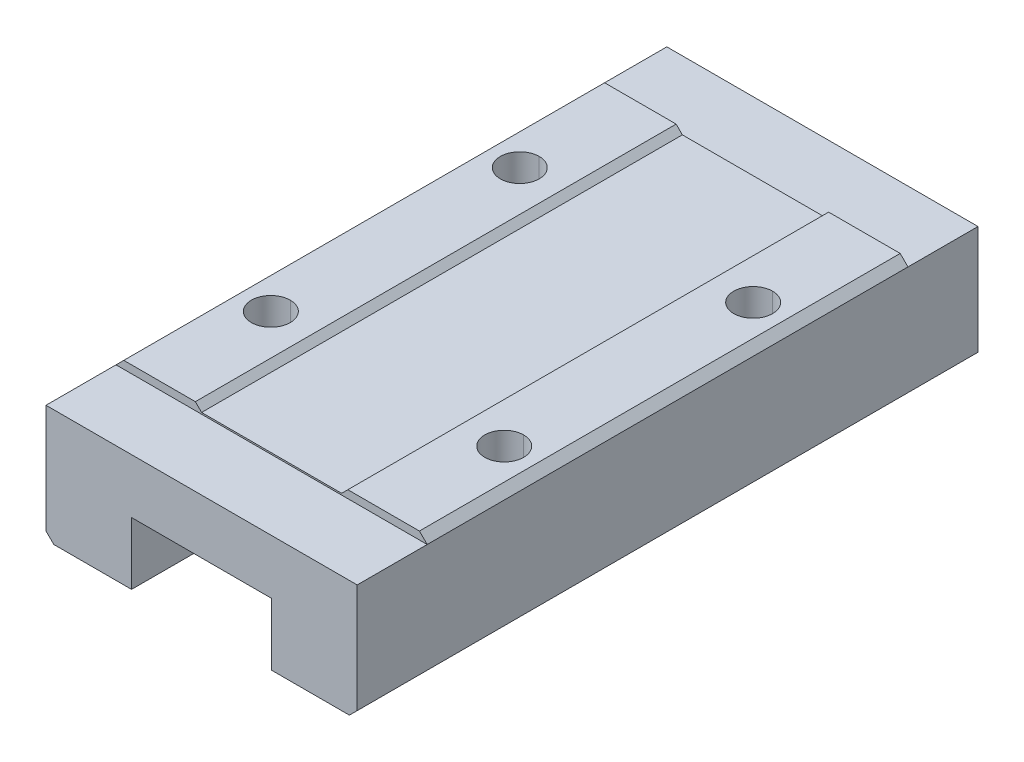
ISO-10303-21;
HEADER;
FILE_DESCRIPTION(('STEP AP214'),'2;1');
FILE_NAME('part.step','',(''),(''),'','','');
FILE_SCHEMA(('AUTOMOTIVE_DESIGN { 1 0 10303 214 1 1 1 1 }'));
ENDSEC;
DATA;
#1=APPLICATION_CONTEXT('core data for automotive mechanical design processes');
#2=APPLICATION_PROTOCOL_DEFINITION('international standard','automotive_design',2000,#1);
#3=PRODUCT_CONTEXT('',#1,'mechanical');
#4=PRODUCT('Part','Part','',(#3));
#5=PRODUCT_RELATED_PRODUCT_CATEGORY('part','',(#4));
#6=PRODUCT_DEFINITION_FORMATION('','',#4);
#7=PRODUCT_DEFINITION_CONTEXT('part definition',#1,'design');
#8=PRODUCT_DEFINITION('design','',#6,#7);
#9=PRODUCT_DEFINITION_SHAPE('','',#8);
#10=(LENGTH_UNIT() NAMED_UNIT(*) SI_UNIT(.MILLI.,.METRE.));
#11=(NAMED_UNIT(*) PLANE_ANGLE_UNIT() SI_UNIT($,.RADIAN.));
#12=(NAMED_UNIT(*) SI_UNIT($,.STERADIAN.) SOLID_ANGLE_UNIT());
#13=UNCERTAINTY_MEASURE_WITH_UNIT(LENGTH_MEASURE(1.E-05),#10,'distance_accuracy_value','');
#14=(GEOMETRIC_REPRESENTATION_CONTEXT(3) GLOBAL_UNCERTAINTY_ASSIGNED_CONTEXT((#13)) GLOBAL_UNIT_ASSIGNED_CONTEXT((#10,
#11,#12)) REPRESENTATION_CONTEXT('',''));
#15=CARTESIAN_POINT('',(0.,0.,0.));
#16=DIRECTION('',(0.,0.,1.));
#17=DIRECTION('',(1.,0.,0.));
#18=AXIS2_PLACEMENT_3D('',#15,#16,#17);
#19=CARTESIAN_POINT('',(-4.5,9.6,-19.95));
#20=DIRECTION('',(-0.707106781186548,-0.707106781186548,0.));
#21=DIRECTION('',(-0.707106781186548,0.707106781186548,0.));
#22=AXIS2_PLACEMENT_3D('',#19,#20,#21);
#23=PLANE('',#22);
#24=DIRECTION('',(0.707106781186548,-0.707106781186548,0.));
#25=VECTOR('',#24,1.);
#26=CARTESIAN_POINT('',(-4.5,9.6,-15.45));
#27=LINE('',#26,#25);
#28=CARTESIAN_POINT('',(-4.9,10.,-15.45));
#29=VERTEX_POINT('',#28);
#30=CARTESIAN_POINT('',(-4.5,9.6,-15.45));
#31=VERTEX_POINT('',#30);
#32=EDGE_CURVE('E371',#29,#31,#27,.T.);
#33=ORIENTED_EDGE('',*,*,#32,.F.);
#34=DIRECTION('',(0.,0.,-1.));
#35=VECTOR('',#34,1.);
#36=CARTESIAN_POINT('',(-4.9,10.,19.95));
#37=LINE('',#36,#35);
#38=CARTESIAN_POINT('',(-4.9,10.,15.45));
#39=VERTEX_POINT('',#38);
#40=EDGE_CURVE('E316',#39,#29,#37,.T.);
#41=ORIENTED_EDGE('',*,*,#40,.F.);
#42=DIRECTION('',(-0.707106781186548,0.707106781186548,0.));
#43=VECTOR('',#42,1.);
#44=CARTESIAN_POINT('',(-4.5,9.6,15.45));
#45=LINE('',#44,#43);
#46=CARTESIAN_POINT('',(-4.5,9.6,15.45));
#47=VERTEX_POINT('',#46);
#48=EDGE_CURVE('E299',#47,#39,#45,.T.);
#49=ORIENTED_EDGE('',*,*,#48,.F.);
#50=DIRECTION('',(0.,0.,1.));
#51=VECTOR('',#50,1.);
#52=CARTESIAN_POINT('',(-4.5,9.6,-19.95));
#53=LINE('',#52,#51);
#54=EDGE_CURVE('E28',#31,#47,#53,.T.);
#55=ORIENTED_EDGE('',*,*,#54,.F.);
#56=EDGE_LOOP('',(#33,#41,#49,#55));
#57=FACE_BOUND('',#56,.T.);
#58=ADVANCED_FACE('F17',(#57),#23,.F.);
#59=CARTESIAN_POINT('',(4.9,10.,19.95));
#60=DIRECTION('',(0.707106781186548,-0.707106781186547,0.));
#61=DIRECTION('',(0.,0.,-1.));
#62=AXIS2_PLACEMENT_3D('',#59,#60,#61);
#63=PLANE('',#62);
#64=DIRECTION('',(0.707106781186547,0.707106781186548,0.));
#65=VECTOR('',#64,1.);
#66=CARTESIAN_POINT('',(4.9,10.,-15.45));
#67=LINE('',#66,#65);
#68=CARTESIAN_POINT('',(4.5,9.6,-15.45));
#69=VERTEX_POINT('',#68);
#70=CARTESIAN_POINT('',(4.9,10.,-15.45));
#71=VERTEX_POINT('',#70);
#72=EDGE_CURVE('E222',#69,#71,#67,.T.);
#73=ORIENTED_EDGE('',*,*,#72,.F.);
#74=DIRECTION('',(0.,0.,1.));
#75=VECTOR('',#74,1.);
#76=CARTESIAN_POINT('',(4.5,9.6,-19.95));
#77=LINE('',#76,#75);
#78=CARTESIAN_POINT('',(4.5,9.6,15.45));
#79=VERTEX_POINT('',#78);
#80=EDGE_CURVE('E11',#69,#79,#77,.T.);
#81=ORIENTED_EDGE('',*,*,#80,.T.);
#82=DIRECTION('',(-0.707106781186547,-0.707106781186548,0.));
#83=VECTOR('',#82,1.);
#84=CARTESIAN_POINT('',(4.9,10.,15.45));
#85=LINE('',#84,#83);
#86=CARTESIAN_POINT('',(4.9,10.,15.45));
#87=VERTEX_POINT('',#86);
#88=EDGE_CURVE('E367',#87,#79,#85,.T.);
#89=ORIENTED_EDGE('',*,*,#88,.F.);
#90=DIRECTION('',(0.,0.,1.));
#91=VECTOR('',#90,1.);
#92=CARTESIAN_POINT('',(4.9,10.,19.95));
#93=LINE('',#92,#91);
#94=EDGE_CURVE('E21',#71,#87,#93,.T.);
#95=ORIENTED_EDGE('',*,*,#94,.F.);
#96=EDGE_LOOP('',(#73,#81,#89,#95));
#97=FACE_BOUND('',#96,.T.);
#98=ADVANCED_FACE('F680',(#97),#63,.F.);
#99=CARTESIAN_POINT('',(-4.5,9.6,-19.95));
#100=DIRECTION('',(0.,-1.,0.));
#101=DIRECTION('',(0.,0.,-1.));
#102=AXIS2_PLACEMENT_3D('',#99,#100,#101);
#103=PLANE('',#102);
#104=ORIENTED_EDGE('',*,*,#54,.T.);
#105=DIRECTION('',(-1.,0.,0.));
#106=VECTOR('',#105,1.);
#107=CARTESIAN_POINT('',(10.,9.6,15.45));
#108=LINE('',#107,#106);
#109=EDGE_CURVE('E303',#79,#47,#108,.T.);
#110=ORIENTED_EDGE('',*,*,#109,.F.);
#111=ORIENTED_EDGE('',*,*,#80,.F.);
#112=DIRECTION('',(1.,0.,0.));
#113=VECTOR('',#112,1.);
#114=CARTESIAN_POINT('',(-10.,9.6,-15.45));
#115=LINE('',#114,#113);
#116=EDGE_CURVE('E298',#31,#69,#115,.T.);
#117=ORIENTED_EDGE('',*,*,#116,.F.);
#118=EDGE_LOOP('',(#104,#110,#111,#117));
#119=FACE_BOUND('',#118,.T.);
#120=ADVANCED_FACE('F686',(#119),#103,.F.);
#121=CARTESIAN_POINT('',(0.,9.5,0.));
#122=DIRECTION('',(0.,1.,0.));
#123=DIRECTION('',(1.,0.,0.));
#124=AXIS2_PLACEMENT_3D('',#121,#122,#123);
#125=PLANE('',#124);
#126=DIRECTION('',(0.,0.,-1.));
#127=VECTOR('',#126,1.);
#128=CARTESIAN_POINT('',(10.,9.5,19.95));
#129=LINE('',#128,#127);
#130=CARTESIAN_POINT('',(10.,9.5,19.95));
#131=VERTEX_POINT('',#130);
#132=CARTESIAN_POINT('',(10.,9.5,15.45));
#133=VERTEX_POINT('',#132);
#134=EDGE_CURVE('E225',#131,#133,#129,.T.);
#135=ORIENTED_EDGE('',*,*,#134,.T.);
#136=DIRECTION('',(-1.,0.,0.));
#137=VECTOR('',#136,1.);
#138=CARTESIAN_POINT('',(10.,9.5,15.45));
#139=LINE('',#138,#137);
#140=CARTESIAN_POINT('',(-10.,9.5,15.45));
#141=VERTEX_POINT('',#140);
#142=EDGE_CURVE('E302',#133,#141,#139,.T.);
#143=ORIENTED_EDGE('',*,*,#142,.T.);
#144=DIRECTION('',(0.,0.,-1.));
#145=VECTOR('',#144,1.);
#146=CARTESIAN_POINT('',(-10.,9.5,19.95));
#147=LINE('',#146,#145);
#148=CARTESIAN_POINT('',(-10.,9.5,19.95));
#149=VERTEX_POINT('',#148);
#150=EDGE_CURVE('E270',#149,#141,#147,.T.);
#151=ORIENTED_EDGE('',*,*,#150,.F.);
#152=DIRECTION('',(1.,0.,0.));
#153=VECTOR('',#152,1.);
#154=CARTESIAN_POINT('',(10.,9.5,19.95));
#155=LINE('',#154,#153);
#156=EDGE_CURVE('E339',#149,#131,#155,.T.);
#157=ORIENTED_EDGE('',*,*,#156,.T.);
#158=EDGE_LOOP('',(#135,#143,#151,#157));
#159=FACE_BOUND('',#158,.T.);
#160=ADVANCED_FACE('F579',(#159),#125,.T.);
#161=CARTESIAN_POINT('',(10.,9.5,15.45));
#162=DIRECTION('',(0.,0.,-1.));
#163=DIRECTION('',(-1.,0.,0.));
#164=AXIS2_PLACEMENT_3D('',#161,#162,#163);
#165=PLANE('',#164);
#166=DIRECTION('',(-1.,0.,0.));
#167=VECTOR('',#166,1.);
#168=CARTESIAN_POINT('',(10.,10.,15.45));
#169=LINE('',#168,#167);
#170=CARTESIAN_POINT('',(9.5,10.,15.45));
#171=VERTEX_POINT('',#170);
#172=EDGE_CURVE('E215',#171,#87,#169,.T.);
#173=ORIENTED_EDGE('',*,*,#172,.T.);
#174=ORIENTED_EDGE('',*,*,#88,.T.);
#175=ORIENTED_EDGE('',*,*,#109,.T.);
#176=ORIENTED_EDGE('',*,*,#48,.T.);
#177=DIRECTION('',(-1.,0.,0.));
#178=VECTOR('',#177,1.);
#179=CARTESIAN_POINT('',(10.,10.,15.45));
#180=LINE('',#179,#178);
#181=CARTESIAN_POINT('',(-9.5,10.,15.45));
#182=VERTEX_POINT('',#181);
#183=EDGE_CURVE('E321',#39,#182,#180,.T.);
#184=ORIENTED_EDGE('',*,*,#183,.T.);
#185=DIRECTION('',(-0.707106781186548,-0.707106781186548,0.));
#186=VECTOR('',#185,1.);
#187=CARTESIAN_POINT('',(-10.,9.5,15.45));
#188=LINE('',#187,#186);
#189=EDGE_CURVE('E206',#182,#141,#188,.T.);
#190=ORIENTED_EDGE('',*,*,#189,.T.);
#191=ORIENTED_EDGE('',*,*,#142,.F.);
#192=DIRECTION('',(-0.707106781186548,0.707106781186548,0.));
#193=VECTOR('',#192,1.);
#194=CARTESIAN_POINT('',(9.5,10.,15.45));
#195=LINE('',#194,#193);
#196=EDGE_CURVE('E207',#133,#171,#195,.T.);
#197=ORIENTED_EDGE('',*,*,#196,.T.);
#198=EDGE_LOOP('',(#173,#174,#175,#176,#184,#190,#191,#197));
#199=FACE_BOUND('',#198,.T.);
#200=ADVANCED_FACE('F514',(#199),#165,.F.);
#201=CARTESIAN_POINT('',(0.,9.5,0.));
#202=DIRECTION('',(0.,1.,0.));
#203=DIRECTION('',(1.,0.,0.));
#204=AXIS2_PLACEMENT_3D('',#201,#202,#203);
#205=PLANE('',#204);
#206=DIRECTION('',(0.,0.,1.));
#207=VECTOR('',#206,1.);
#208=CARTESIAN_POINT('',(-10.,9.5,-19.95));
#209=LINE('',#208,#207);
#210=CARTESIAN_POINT('',(-10.,9.5,-19.95));
#211=VERTEX_POINT('',#210);
#212=CARTESIAN_POINT('',(-10.,9.5,-15.45));
#213=VERTEX_POINT('',#212);
#214=EDGE_CURVE('E353',#211,#213,#209,.T.);
#215=ORIENTED_EDGE('',*,*,#214,.T.);
#216=DIRECTION('',(1.,0.,0.));
#217=VECTOR('',#216,1.);
#218=CARTESIAN_POINT('',(-10.,9.5,-15.45));
#219=LINE('',#218,#217);
#220=CARTESIAN_POINT('',(10.,9.5,-15.45));
#221=VERTEX_POINT('',#220);
#222=EDGE_CURVE('E297',#213,#221,#219,.T.);
#223=ORIENTED_EDGE('',*,*,#222,.T.);
#224=DIRECTION('',(0.,0.,1.));
#225=VECTOR('',#224,1.);
#226=CARTESIAN_POINT('',(10.,9.5,19.95));
#227=LINE('',#226,#225);
#228=CARTESIAN_POINT('',(10.,9.5,-19.95));
#229=VERTEX_POINT('',#228);
#230=EDGE_CURVE('E413',#229,#221,#227,.T.);
#231=ORIENTED_EDGE('',*,*,#230,.F.);
#232=DIRECTION('',(-1.,0.,0.));
#233=VECTOR('',#232,1.);
#234=CARTESIAN_POINT('',(-10.,9.5,-19.95));
#235=LINE('',#234,#233);
#236=EDGE_CURVE('E259',#229,#211,#235,.T.);
#237=ORIENTED_EDGE('',*,*,#236,.T.);
#238=EDGE_LOOP('',(#215,#223,#231,#237));
#239=FACE_BOUND('',#238,.T.);
#240=ADVANCED_FACE('F568',(#239),#205,.T.);
#241=CARTESIAN_POINT('',(-10.,9.5,-15.45));
#242=DIRECTION('',(0.,0.,1.));
#243=DIRECTION('',(1.,0.,0.));
#244=AXIS2_PLACEMENT_3D('',#241,#242,#243);
#245=PLANE('',#244);
#246=ORIENTED_EDGE('',*,*,#116,.T.);
#247=ORIENTED_EDGE('',*,*,#72,.T.);
#248=DIRECTION('',(1.,0.,0.));
#249=VECTOR('',#248,1.);
#250=CARTESIAN_POINT('',(-10.,10.,-15.45));
#251=LINE('',#250,#249);
#252=CARTESIAN_POINT('',(9.5,10.,-15.45));
#253=VERTEX_POINT('',#252);
#254=EDGE_CURVE('E213',#71,#253,#251,.T.);
#255=ORIENTED_EDGE('',*,*,#254,.T.);
#256=DIRECTION('',(0.707106781186548,-0.707106781186548,0.));
#257=VECTOR('',#256,1.);
#258=CARTESIAN_POINT('',(9.5,10.,-15.45));
#259=LINE('',#258,#257);
#260=EDGE_CURVE('E194',#253,#221,#259,.T.);
#261=ORIENTED_EDGE('',*,*,#260,.T.);
#262=ORIENTED_EDGE('',*,*,#222,.F.);
#263=DIRECTION('',(0.707106781186548,0.707106781186548,0.));
#264=VECTOR('',#263,1.);
#265=CARTESIAN_POINT('',(-10.,9.5,-15.45));
#266=LINE('',#265,#264);
#267=CARTESIAN_POINT('',(-9.5,10.,-15.45));
#268=VERTEX_POINT('',#267);
#269=EDGE_CURVE('E274',#213,#268,#266,.T.);
#270=ORIENTED_EDGE('',*,*,#269,.T.);
#271=DIRECTION('',(1.,0.,0.));
#272=VECTOR('',#271,1.);
#273=CARTESIAN_POINT('',(-10.,10.,-15.45));
#274=LINE('',#273,#272);
#275=EDGE_CURVE('E320',#268,#29,#274,.T.);
#276=ORIENTED_EDGE('',*,*,#275,.T.);
#277=ORIENTED_EDGE('',*,*,#32,.T.);
#278=EDGE_LOOP('',(#246,#247,#255,#261,#262,#270,#276,#277));
#279=FACE_BOUND('',#278,.T.);
#280=ADVANCED_FACE('F220',(#279),#245,.F.);
#281=CARTESIAN_POINT('',(-10.,9.5,19.95));
#282=DIRECTION('',(0.707106781186548,-0.707106781186548,0.));
#283=DIRECTION('',(0.,0.,-1.));
#284=AXIS2_PLACEMENT_3D('',#281,#282,#283);
#285=PLANE('',#284);
#286=ORIENTED_EDGE('',*,*,#189,.F.);
#287=DIRECTION('',(0.,0.,1.));
#288=VECTOR('',#287,1.);
#289=CARTESIAN_POINT('',(-9.5,10.,19.95));
#290=LINE('',#289,#288);
#291=EDGE_CURVE('E429',#268,#182,#290,.T.);
#292=ORIENTED_EDGE('',*,*,#291,.F.);
#293=ORIENTED_EDGE('',*,*,#269,.F.);
#294=DIRECTION('',(0.,0.,-1.));
#295=VECTOR('',#294,1.);
#296=CARTESIAN_POINT('',(-10.,9.5,19.95));
#297=LINE('',#296,#295);
#298=EDGE_CURVE('E349',#141,#213,#297,.T.);
#299=ORIENTED_EDGE('',*,*,#298,.F.);
#300=EDGE_LOOP('',(#286,#292,#293,#299));
#301=FACE_BOUND('',#300,.T.);
#302=ADVANCED_FACE('F571',(#301),#285,.F.);
#303=CARTESIAN_POINT('',(9.5,10.,19.95));
#304=DIRECTION('',(-0.707106781186548,-0.707106781186548,0.));
#305=DIRECTION('',(-0.707106781186548,0.707106781186548,0.));
#306=AXIS2_PLACEMENT_3D('',#303,#304,#305);
#307=PLANE('',#306);
#308=ORIENTED_EDGE('',*,*,#196,.F.);
#309=DIRECTION('',(0.,0.,1.));
#310=VECTOR('',#309,1.);
#311=CARTESIAN_POINT('',(10.,9.5,19.95));
#312=LINE('',#311,#310);
#313=EDGE_CURVE('E201',#221,#133,#312,.T.);
#314=ORIENTED_EDGE('',*,*,#313,.F.);
#315=ORIENTED_EDGE('',*,*,#260,.F.);
#316=DIRECTION('',(0.,0.,-1.));
#317=VECTOR('',#316,1.);
#318=CARTESIAN_POINT('',(9.5,10.,19.95));
#319=LINE('',#318,#317);
#320=EDGE_CURVE('E198',#171,#253,#319,.T.);
#321=ORIENTED_EDGE('',*,*,#320,.F.);
#322=EDGE_LOOP('',(#308,#314,#315,#321));
#323=FACE_BOUND('',#322,.T.);
#324=ADVANCED_FACE('F197',(#323),#307,.F.);
#325=CARTESIAN_POINT('',(10.,2.5,19.95));
#326=DIRECTION('',(-0.707106781186548,0.707106781186548,0.));
#327=DIRECTION('',(0.,0.,1.));
#328=AXIS2_PLACEMENT_3D('',#325,#326,#327);
#329=PLANE('',#328);
#330=DIRECTION('',(0.707106781186548,0.707106781186548,0.));
#331=VECTOR('',#330,1.);
#332=CARTESIAN_POINT('',(10.,2.5,19.95));
#333=LINE('',#332,#331);
#334=CARTESIAN_POINT('',(9.5,2.,19.95));
#335=VERTEX_POINT('',#334);
#336=CARTESIAN_POINT('',(10.,2.5,19.95));
#337=VERTEX_POINT('',#336);
#338=EDGE_CURVE('E237',#335,#337,#333,.T.);
#339=ORIENTED_EDGE('',*,*,#338,.F.);
#340=DIRECTION('',(0.,0.,1.));
#341=VECTOR('',#340,1.);
#342=CARTESIAN_POINT('',(9.5,2.,19.95));
#343=LINE('',#342,#341);
#344=CARTESIAN_POINT('',(9.5,2.,-19.95));
#345=VERTEX_POINT('',#344);
#346=EDGE_CURVE('E382',#345,#335,#343,.T.);
#347=ORIENTED_EDGE('',*,*,#346,.F.);
#348=DIRECTION('',(-0.707106781186548,-0.707106781186548,0.));
#349=VECTOR('',#348,1.);
#350=CARTESIAN_POINT('',(3.75,-3.75,-19.95));
#351=LINE('',#350,#349);
#352=CARTESIAN_POINT('',(10.,2.5,-19.95));
#353=VERTEX_POINT('',#352);
#354=EDGE_CURVE('E258',#353,#345,#351,.T.);
#355=ORIENTED_EDGE('',*,*,#354,.F.);
#356=DIRECTION('',(0.,0.,-1.));
#357=VECTOR('',#356,1.);
#358=CARTESIAN_POINT('',(10.,2.5,19.95));
#359=LINE('',#358,#357);
#360=EDGE_CURVE('E446',#337,#353,#359,.T.);
#361=ORIENTED_EDGE('',*,*,#360,.F.);
#362=EDGE_LOOP('',(#339,#347,#355,#361));
#363=FACE_BOUND('',#362,.T.);
#364=ADVANCED_FACE('F630',(#363),#329,.F.);
#365=CARTESIAN_POINT('',(-9.5,2.,19.95));
#366=DIRECTION('',(0.707106781186548,0.707106781186548,0.));
#367=DIRECTION('',(0.,0.,-1.));
#368=AXIS2_PLACEMENT_3D('',#365,#366,#367);
#369=PLANE('',#368);
#370=DIRECTION('',(0.707106781186548,-0.707106781186548,0.));
#371=VECTOR('',#370,1.);
#372=CARTESIAN_POINT('',(-9.5,2.,19.95));
#373=LINE('',#372,#371);
#374=CARTESIAN_POINT('',(-10.,2.5,19.95));
#375=VERTEX_POINT('',#374);
#376=CARTESIAN_POINT('',(-9.5,2.,19.95));
#377=VERTEX_POINT('',#376);
#378=EDGE_CURVE('E433',#375,#377,#373,.T.);
#379=ORIENTED_EDGE('',*,*,#378,.F.);
#380=DIRECTION('',(0.,0.,1.));
#381=VECTOR('',#380,1.);
#382=CARTESIAN_POINT('',(-10.,2.5,19.95));
#383=LINE('',#382,#381);
#384=CARTESIAN_POINT('',(-10.,2.5,-19.95));
#385=VERTEX_POINT('',#384);
#386=EDGE_CURVE('E266',#385,#375,#383,.T.);
#387=ORIENTED_EDGE('',*,*,#386,.F.);
#388=DIRECTION('',(-0.707106781186548,0.707106781186548,0.));
#389=VECTOR('',#388,1.);
#390=CARTESIAN_POINT('',(-3.75,-3.75,-19.95));
#391=LINE('',#390,#389);
#392=CARTESIAN_POINT('',(-9.5,2.,-19.95));
#393=VERTEX_POINT('',#392);
#394=EDGE_CURVE('E348',#393,#385,#391,.T.);
#395=ORIENTED_EDGE('',*,*,#394,.F.);
#396=DIRECTION('',(0.,0.,-1.));
#397=VECTOR('',#396,1.);
#398=CARTESIAN_POINT('',(-9.5,2.,19.95));
#399=LINE('',#398,#397);
#400=EDGE_CURVE('E394',#377,#393,#399,.T.);
#401=ORIENTED_EDGE('',*,*,#400,.F.);
#402=EDGE_LOOP('',(#379,#387,#395,#401));
#403=FACE_BOUND('',#402,.T.);
#404=ADVANCED_FACE('F725',(#403),#369,.F.);
#405=CARTESIAN_POINT('',(-7.5,10.,-8.));
#406=DIRECTION('',(0.,1.,0.));
#407=DIRECTION('',(0.,0.,1.));
#408=AXIS2_PLACEMENT_3D('',#405,#406,#407);
#409=CYLINDRICAL_SURFACE('',#408,1.25);
#410=DIRECTION('',(0.,1.,0.));
#411=VECTOR('',#410,1.);
#412=CARTESIAN_POINT('',(-7.5,10.,-9.25));
#413=LINE('',#412,#411);
#414=CARTESIAN_POINT('',(-7.5,5.6,-9.25));
#415=VERTEX_POINT('',#414);
#416=CARTESIAN_POINT('',(-7.5,10.,-9.25));
#417=VERTEX_POINT('',#416);
#418=EDGE_CURVE('E304',#415,#417,#413,.T.);
#419=ORIENTED_EDGE('',*,*,#418,.F.);
#420=CARTESIAN_POINT('',(-7.5,5.6,-8.));
#421=DIRECTION('',(0.,1.,0.));
#422=DIRECTION('',(0.,0.,1.));
#423=AXIS2_PLACEMENT_3D('',#420,#421,#422);
#424=CIRCLE('',#423,1.25);
#425=CARTESIAN_POINT('',(-7.5,5.6,-6.75));
#426=VERTEX_POINT('',#425);
#427=EDGE_CURVE('E246',#426,#415,#424,.T.);
#428=ORIENTED_EDGE('',*,*,#427,.F.);
#429=DIRECTION('',(0.,1.,0.));
#430=VECTOR('',#429,1.);
#431=CARTESIAN_POINT('',(-7.5,10.,-6.75));
#432=LINE('',#431,#430);
#433=CARTESIAN_POINT('',(-7.5,10.,-6.75));
#434=VERTEX_POINT('',#433);
#435=EDGE_CURVE('E410',#426,#434,#432,.T.);
#436=ORIENTED_EDGE('',*,*,#435,.T.);
#437=CARTESIAN_POINT('',(-7.5,10.,-8.));
#438=DIRECTION('',(0.,1.,0.));
#439=DIRECTION('',(0.,0.,1.));
#440=AXIS2_PLACEMENT_3D('',#437,#438,#439);
#441=CIRCLE('',#440,1.25);
#442=EDGE_CURVE('E344',#434,#417,#441,.T.);
#443=ORIENTED_EDGE('',*,*,#442,.T.);
#444=EDGE_LOOP('',(#419,#428,#436,#443));
#445=FACE_BOUND('',#444,.T.);
#446=ADVANCED_FACE('F723',(#445),#409,.F.);
#447=CARTESIAN_POINT('',(-7.5,5.6,-8.));
#448=DIRECTION('',(0.,1.,0.));
#449=DIRECTION('',(0.,0.,1.));
#450=AXIS2_PLACEMENT_3D('',#447,#448,#449);
#451=CONICAL_SURFACE('',#450,1.25,1.02974425867665);
#452=DIRECTION('',(0.,0.515038074910055,-0.857167300702112));
#453=VECTOR('',#452,1.);
#454=CARTESIAN_POINT('',(-7.5,5.6,-9.25));
#455=LINE('',#454,#453);
#456=CARTESIAN_POINT('',(-7.5,4.84892422621555,-8.));
#457=VERTEX_POINT('',#456);
#458=EDGE_CURVE('E395',#457,#415,#455,.T.);
#459=ORIENTED_EDGE('',*,*,#458,.F.);
#460=DIRECTION('',(0.,0.515038074910055,0.857167300702112));
#461=VECTOR('',#460,1.);
#462=CARTESIAN_POINT('',(-7.5,5.6,-6.75));
#463=LINE('',#462,#461);
#464=EDGE_CURVE('E400',#457,#426,#463,.T.);
#465=ORIENTED_EDGE('',*,*,#464,.T.);
#466=ORIENTED_EDGE('',*,*,#427,.T.);
#467=EDGE_LOOP('',(#459,#465,#466));
#468=FACE_BOUND('',#467,.T.);
#469=ADVANCED_FACE('F675',(#468),#451,.F.);
#470=CARTESIAN_POINT('',(7.5,10.,8.));
#471=DIRECTION('',(0.,1.,0.));
#472=DIRECTION('',(0.,0.,1.));
#473=AXIS2_PLACEMENT_3D('',#470,#471,#472);
#474=CYLINDRICAL_SURFACE('',#473,1.25);
#475=DIRECTION('',(0.,1.,0.));
#476=VECTOR('',#475,1.);
#477=CARTESIAN_POINT('',(7.5,10.,6.75));
#478=LINE('',#477,#476);
#479=CARTESIAN_POINT('',(7.5,5.6,6.75));
#480=VERTEX_POINT('',#479);
#481=CARTESIAN_POINT('',(7.5,10.,6.75));
#482=VERTEX_POINT('',#481);
#483=EDGE_CURVE('E315',#480,#482,#478,.T.);
#484=ORIENTED_EDGE('',*,*,#483,.F.);
#485=CARTESIAN_POINT('',(7.5,5.6,8.));
#486=DIRECTION('',(0.,1.,0.));
#487=DIRECTION('',(0.,0.,1.));
#488=AXIS2_PLACEMENT_3D('',#485,#486,#487);
#489=CIRCLE('',#488,1.25);
#490=CARTESIAN_POINT('',(7.5,5.6,9.25));
#491=VERTEX_POINT('',#490);
#492=EDGE_CURVE('E361',#491,#480,#489,.T.);
#493=ORIENTED_EDGE('',*,*,#492,.F.);
#494=DIRECTION('',(0.,1.,0.));
#495=VECTOR('',#494,1.);
#496=CARTESIAN_POINT('',(7.5,10.,9.25));
#497=LINE('',#496,#495);
#498=CARTESIAN_POINT('',(7.5,10.,9.25));
#499=VERTEX_POINT('',#498);
#500=EDGE_CURVE('E314',#491,#499,#497,.T.);
#501=ORIENTED_EDGE('',*,*,#500,.T.);
#502=CARTESIAN_POINT('',(7.5,10.,8.));
#503=DIRECTION('',(0.,1.,0.));
#504=DIRECTION('',(0.,0.,1.));
#505=AXIS2_PLACEMENT_3D('',#502,#503,#504);
#506=CIRCLE('',#505,1.25);
#507=EDGE_CURVE('E217',#499,#482,#506,.T.);
#508=ORIENTED_EDGE('',*,*,#507,.T.);
#509=EDGE_LOOP('',(#484,#493,#501,#508));
#510=FACE_BOUND('',#509,.T.);
#511=ADVANCED_FACE('F655',(#510),#474,.F.);
#512=CARTESIAN_POINT('',(7.5,5.6,8.));
#513=DIRECTION('',(0.,1.,0.));
#514=DIRECTION('',(0.,0.,1.));
#515=AXIS2_PLACEMENT_3D('',#512,#513,#514);
#516=CONICAL_SURFACE('',#515,1.25,1.02974425867665);
#517=DIRECTION('',(0.,0.515038074910055,-0.857167300702112));
#518=VECTOR('',#517,1.);
#519=CARTESIAN_POINT('',(7.5,5.6,6.75));
#520=LINE('',#519,#518);
#521=CARTESIAN_POINT('',(7.5,4.84892422621555,8.));
#522=VERTEX_POINT('',#521);
#523=EDGE_CURVE('E288',#522,#480,#520,.T.);
#524=ORIENTED_EDGE('',*,*,#523,.F.);
#525=DIRECTION('',(0.,0.515038074910055,0.857167300702112));
#526=VECTOR('',#525,1.);
#527=CARTESIAN_POINT('',(7.5,5.6,9.25));
#528=LINE('',#527,#526);
#529=EDGE_CURVE('E330',#522,#491,#528,.T.);
#530=ORIENTED_EDGE('',*,*,#529,.T.);
#531=ORIENTED_EDGE('',*,*,#492,.T.);
#532=EDGE_LOOP('',(#524,#530,#531));
#533=FACE_BOUND('',#532,.T.);
#534=ADVANCED_FACE('F663',(#533),#516,.F.);
#535=CARTESIAN_POINT('',(7.5,10.,-8.));
#536=DIRECTION('',(0.,1.,0.));
#537=DIRECTION('',(0.,0.,1.));
#538=AXIS2_PLACEMENT_3D('',#535,#536,#537);
#539=CYLINDRICAL_SURFACE('',#538,1.25);
#540=DIRECTION('',(0.,1.,0.));
#541=VECTOR('',#540,1.);
#542=CARTESIAN_POINT('',(7.5,10.,-9.25));
#543=LINE('',#542,#541);
#544=CARTESIAN_POINT('',(7.5,5.6,-9.25));
#545=VERTEX_POINT('',#544);
#546=CARTESIAN_POINT('',(7.5,10.,-9.25));
#547=VERTEX_POINT('',#546);
#548=EDGE_CURVE('E287',#545,#547,#543,.T.);
#549=ORIENTED_EDGE('',*,*,#548,.F.);
#550=CARTESIAN_POINT('',(7.5,5.6,-8.));
#551=DIRECTION('',(0.,1.,0.));
#552=DIRECTION('',(0.,0.,1.));
#553=AXIS2_PLACEMENT_3D('',#550,#551,#552);
#554=CIRCLE('',#553,1.25);
#555=CARTESIAN_POINT('',(7.5,5.6,-6.75));
#556=VERTEX_POINT('',#555);
#557=EDGE_CURVE('E417',#556,#545,#554,.T.);
#558=ORIENTED_EDGE('',*,*,#557,.F.);
#559=DIRECTION('',(0.,1.,0.));
#560=VECTOR('',#559,1.);
#561=CARTESIAN_POINT('',(7.5,10.,-6.75));
#562=LINE('',#561,#560);
#563=CARTESIAN_POINT('',(7.5,10.,-6.75));
#564=VERTEX_POINT('',#563);
#565=EDGE_CURVE('E338',#556,#564,#562,.T.);
#566=ORIENTED_EDGE('',*,*,#565,.T.);
#567=CARTESIAN_POINT('',(7.5,10.,-8.));
#568=DIRECTION('',(0.,1.,0.));
#569=DIRECTION('',(0.,0.,1.));
#570=AXIS2_PLACEMENT_3D('',#567,#568,#569);
#571=CIRCLE('',#570,1.25);
#572=EDGE_CURVE('E249',#564,#547,#571,.T.);
#573=ORIENTED_EDGE('',*,*,#572,.T.);
#574=EDGE_LOOP('',(#549,#558,#566,#573));
#575=FACE_BOUND('',#574,.T.);
#576=ADVANCED_FACE('F665',(#575),#539,.F.);
#577=CARTESIAN_POINT('',(7.5,5.6,-8.));
#578=DIRECTION('',(0.,1.,0.));
#579=DIRECTION('',(0.,0.,1.));
#580=AXIS2_PLACEMENT_3D('',#577,#578,#579);
#581=CONICAL_SURFACE('',#580,1.25,1.02974425867665);
#582=DIRECTION('',(0.,0.515038074910055,-0.857167300702112));
#583=VECTOR('',#582,1.);
#584=CARTESIAN_POINT('',(7.5,5.6,-9.25));
#585=LINE('',#584,#583);
#586=CARTESIAN_POINT('',(7.5,4.84892422621555,-8.));
#587=VERTEX_POINT('',#586);
#588=EDGE_CURVE('E450',#587,#545,#585,.T.);
#589=ORIENTED_EDGE('',*,*,#588,.F.);
#590=DIRECTION('',(0.,0.515038074910055,0.857167300702112));
#591=VECTOR('',#590,1.);
#592=CARTESIAN_POINT('',(7.5,5.6,-6.75));
#593=LINE('',#592,#591);
#594=EDGE_CURVE('E437',#587,#556,#593,.T.);
#595=ORIENTED_EDGE('',*,*,#594,.T.);
#596=ORIENTED_EDGE('',*,*,#557,.T.);
#597=EDGE_LOOP('',(#589,#595,#596));
#598=FACE_BOUND('',#597,.T.);
#599=ADVANCED_FACE('F672',(#598),#581,.F.);
#600=CARTESIAN_POINT('',(-7.5,10.,8.));
#601=DIRECTION('',(0.,1.,0.));
#602=DIRECTION('',(0.,0.,1.));
#603=AXIS2_PLACEMENT_3D('',#600,#601,#602);
#604=CYLINDRICAL_SURFACE('',#603,1.25);
#605=DIRECTION('',(0.,1.,0.));
#606=VECTOR('',#605,1.);
#607=CARTESIAN_POINT('',(-7.5,10.,6.75));
#608=LINE('',#607,#606);
#609=CARTESIAN_POINT('',(-7.5,5.6,6.75));
#610=VERTEX_POINT('',#609);
#611=CARTESIAN_POINT('',(-7.5,10.,6.75));
#612=VERTEX_POINT('',#611);
#613=EDGE_CURVE('E294',#610,#612,#608,.T.);
#614=ORIENTED_EDGE('',*,*,#613,.F.);
#615=CARTESIAN_POINT('',(-7.5,5.6,8.));
#616=DIRECTION('',(0.,1.,0.));
#617=DIRECTION('',(0.,0.,1.));
#618=AXIS2_PLACEMENT_3D('',#615,#616,#617);
#619=CIRCLE('',#618,1.25);
#620=CARTESIAN_POINT('',(-7.5,5.6,9.25));
#621=VERTEX_POINT('',#620);
#622=EDGE_CURVE('E393',#621,#610,#619,.T.);
#623=ORIENTED_EDGE('',*,*,#622,.F.);
#624=DIRECTION('',(0.,1.,0.));
#625=VECTOR('',#624,1.);
#626=CARTESIAN_POINT('',(-7.5,10.,9.25));
#627=LINE('',#626,#625);
#628=CARTESIAN_POINT('',(-7.5,10.,9.25));
#629=VERTEX_POINT('',#628);
#630=EDGE_CURVE('E293',#621,#629,#627,.T.);
#631=ORIENTED_EDGE('',*,*,#630,.T.);
#632=CARTESIAN_POINT('',(-7.5,10.,8.));
#633=DIRECTION('',(0.,1.,0.));
#634=DIRECTION('',(0.,0.,1.));
#635=AXIS2_PLACEMENT_3D('',#632,#633,#634);
#636=CIRCLE('',#635,1.25);
#637=EDGE_CURVE('E440',#629,#612,#636,.T.);
#638=ORIENTED_EDGE('',*,*,#637,.T.);
#639=EDGE_LOOP('',(#614,#623,#631,#638));
#640=FACE_BOUND('',#639,.T.);
#641=ADVANCED_FACE('F704',(#640),#604,.F.);
#642=CARTESIAN_POINT('',(-7.5,5.6,8.));
#643=DIRECTION('',(0.,1.,0.));
#644=DIRECTION('',(0.,0.,1.));
#645=AXIS2_PLACEMENT_3D('',#642,#643,#644);
#646=CONICAL_SURFACE('',#645,1.25,1.02974425867665);
#647=DIRECTION('',(0.,0.515038074910055,-0.857167300702112));
#648=VECTOR('',#647,1.);
#649=CARTESIAN_POINT('',(-7.5,5.6,6.75));
#650=LINE('',#649,#648);
#651=CARTESIAN_POINT('',(-7.5,4.84892422621555,8.));
#652=VERTEX_POINT('',#651);
#653=EDGE_CURVE('E358',#652,#610,#650,.T.);
#654=ORIENTED_EDGE('',*,*,#653,.F.);
#655=DIRECTION('',(0.,0.515038074910055,0.857167300702112));
#656=VECTOR('',#655,1.);
#657=CARTESIAN_POINT('',(-7.5,5.6,9.25));
#658=LINE('',#657,#656);
#659=EDGE_CURVE('E354',#652,#621,#658,.T.);
#660=ORIENTED_EDGE('',*,*,#659,.T.);
#661=ORIENTED_EDGE('',*,*,#622,.T.);
#662=EDGE_LOOP('',(#654,#660,#661));
#663=FACE_BOUND('',#662,.T.);
#664=ADVANCED_FACE('F700',(#663),#646,.F.);
#665=CARTESIAN_POINT('',(-4.5,2.,19.95));
#666=DIRECTION('',(-1.,0.,0.));
#667=DIRECTION('',(0.,0.,1.));
#668=AXIS2_PLACEMENT_3D('',#665,#666,#667);
#669=PLANE('',#668);
#670=DIRECTION('',(0.,1.,0.));
#671=VECTOR('',#670,1.);
#672=CARTESIAN_POINT('',(-4.5,2.,-19.95));
#673=LINE('',#672,#671);
#674=CARTESIAN_POINT('',(-4.5,2.,-19.95));
#675=VERTEX_POINT('',#674);
#676=CARTESIAN_POINT('',(-4.5,6.,-19.95));
#677=VERTEX_POINT('',#676);
#678=EDGE_CURVE('E322',#675,#677,#673,.T.);
#679=ORIENTED_EDGE('',*,*,#678,.T.);
#680=DIRECTION('',(0.,0.,-1.));
#681=VECTOR('',#680,1.);
#682=CARTESIAN_POINT('',(-4.5,6.,19.95));
#683=LINE('',#682,#681);
#684=CARTESIAN_POINT('',(-4.5,6.,19.95));
#685=VERTEX_POINT('',#684);
#686=EDGE_CURVE('E372',#685,#677,#683,.T.);
#687=ORIENTED_EDGE('',*,*,#686,.F.);
#688=DIRECTION('',(0.,1.,0.));
#689=VECTOR('',#688,1.);
#690=CARTESIAN_POINT('',(-4.5,2.,19.95));
#691=LINE('',#690,#689);
#692=CARTESIAN_POINT('',(-4.5,2.,19.95));
#693=VERTEX_POINT('',#692);
#694=EDGE_CURVE('E239',#693,#685,#691,.T.);
#695=ORIENTED_EDGE('',*,*,#694,.F.);
#696=DIRECTION('',(0.,0.,-1.));
#697=VECTOR('',#696,1.);
#698=CARTESIAN_POINT('',(-4.5,2.,19.95));
#699=LINE('',#698,#697);
#700=EDGE_CURVE('E389',#693,#675,#699,.T.);
#701=ORIENTED_EDGE('',*,*,#700,.T.);
#702=EDGE_LOOP('',(#679,#687,#695,#701));
#703=FACE_BOUND('',#702,.T.);
#704=ADVANCED_FACE('F703',(#703),#669,.F.);
#705=CARTESIAN_POINT('',(-10.,2.,19.95));
#706=DIRECTION('',(0.,1.,0.));
#707=DIRECTION('',(1.,0.,0.));
#708=AXIS2_PLACEMENT_3D('',#705,#706,#707);
#709=PLANE('',#708);
#710=DIRECTION('',(1.,0.,0.));
#711=VECTOR('',#710,1.);
#712=CARTESIAN_POINT('',(-10.,2.,19.95));
#713=LINE('',#712,#711);
#714=EDGE_CURVE('E243',#377,#693,#713,.T.);
#715=ORIENTED_EDGE('',*,*,#714,.F.);
#716=ORIENTED_EDGE('',*,*,#400,.T.);
#717=DIRECTION('',(1.,0.,0.));
#718=VECTOR('',#717,1.);
#719=CARTESIAN_POINT('',(-10.,2.,-19.95));
#720=LINE('',#719,#718);
#721=EDGE_CURVE('E326',#393,#675,#720,.T.);
#722=ORIENTED_EDGE('',*,*,#721,.T.);
#723=ORIENTED_EDGE('',*,*,#700,.F.);
#724=EDGE_LOOP('',(#715,#716,#722,#723));
#725=FACE_BOUND('',#724,.T.);
#726=ADVANCED_FACE('F750',(#725),#709,.F.);
#727=CARTESIAN_POINT('',(-10.,10.,19.95));
#728=DIRECTION('',(1.,0.,0.));
#729=DIRECTION('',(0.,-1.,0.));
#730=AXIS2_PLACEMENT_3D('',#727,#728,#729);
#731=PLANE('',#730);
#732=DIRECTION('',(0.,-1.,0.));
#733=VECTOR('',#732,1.);
#734=CARTESIAN_POINT('',(-10.,10.,-19.95));
#735=LINE('',#734,#733);
#736=EDGE_CURVE('E278',#211,#385,#735,.T.);
#737=ORIENTED_EDGE('',*,*,#736,.T.);
#738=ORIENTED_EDGE('',*,*,#386,.T.);
#739=DIRECTION('',(0.,-1.,0.));
#740=VECTOR('',#739,1.);
#741=CARTESIAN_POINT('',(-10.,10.,19.95));
#742=LINE('',#741,#740);
#743=EDGE_CURVE('E343',#149,#375,#742,.T.);
#744=ORIENTED_EDGE('',*,*,#743,.F.);
#745=ORIENTED_EDGE('',*,*,#150,.T.);
#746=ORIENTED_EDGE('',*,*,#298,.T.);
#747=ORIENTED_EDGE('',*,*,#214,.F.);
#748=EDGE_LOOP('',(#737,#738,#744,#745,#746,#747));
#749=FACE_BOUND('',#748,.T.);
#750=ADVANCED_FACE('F575',(#749),#731,.F.);
#751=CARTESIAN_POINT('',(-10.,10.,19.95));
#752=DIRECTION('',(0.,-1.,0.));
#753=DIRECTION('',(0.,0.,-1.));
#754=AXIS2_PLACEMENT_3D('',#751,#752,#753);
#755=PLANE('',#754);
#756=ORIENTED_EDGE('',*,*,#572,.F.);
#757=CARTESIAN_POINT('',(7.5,10.,-8.));
#758=DIRECTION('',(0.,1.,0.));
#759=DIRECTION('',(0.,0.,1.));
#760=AXIS2_PLACEMENT_3D('',#757,#758,#759);
#761=CIRCLE('',#760,1.25);
#762=EDGE_CURVE('E334',#547,#564,#761,.T.);
#763=ORIENTED_EDGE('',*,*,#762,.F.);
#764=EDGE_LOOP('',(#756,#763));
#765=FACE_BOUND('',#764,.T.);
#766=ORIENTED_EDGE('',*,*,#507,.F.);
#767=CARTESIAN_POINT('',(7.5,10.,8.));
#768=DIRECTION('',(0.,1.,0.));
#769=DIRECTION('',(0.,0.,1.));
#770=AXIS2_PLACEMENT_3D('',#767,#768,#769);
#771=CIRCLE('',#770,1.25);
#772=EDGE_CURVE('E310',#482,#499,#771,.T.);
#773=ORIENTED_EDGE('',*,*,#772,.F.);
#774=EDGE_LOOP('',(#766,#773));
#775=FACE_BOUND('',#774,.T.);
#776=ORIENTED_EDGE('',*,*,#254,.F.);
#777=ORIENTED_EDGE('',*,*,#94,.T.);
#778=ORIENTED_EDGE('',*,*,#172,.F.);
#779=ORIENTED_EDGE('',*,*,#320,.T.);
#780=EDGE_LOOP('',(#776,#777,#778,#779));
#781=FACE_BOUND('',#780,.T.);
#782=ADVANCED_FACE('F211',(#765,#775,#781),#755,.F.);
#783=CARTESIAN_POINT('',(10.,10.,19.95));
#784=DIRECTION('',(-1.,0.,0.));
#785=DIRECTION('',(0.,1.,0.));
#786=AXIS2_PLACEMENT_3D('',#783,#784,#785);
#787=PLANE('',#786);
#788=DIRECTION('',(0.,1.,0.));
#789=VECTOR('',#788,1.);
#790=CARTESIAN_POINT('',(10.,10.,19.95));
#791=LINE('',#790,#789);
#792=EDGE_CURVE('E282',#337,#131,#791,.T.);
#793=ORIENTED_EDGE('',*,*,#792,.F.);
#794=ORIENTED_EDGE('',*,*,#360,.T.);
#795=DIRECTION('',(0.,1.,0.));
#796=VECTOR('',#795,1.);
#797=CARTESIAN_POINT('',(10.,10.,-19.95));
#798=LINE('',#797,#796);
#799=EDGE_CURVE('E254',#353,#229,#798,.T.);
#800=ORIENTED_EDGE('',*,*,#799,.T.);
#801=ORIENTED_EDGE('',*,*,#230,.T.);
#802=ORIENTED_EDGE('',*,*,#313,.T.);
#803=ORIENTED_EDGE('',*,*,#134,.F.);
#804=EDGE_LOOP('',(#793,#794,#800,#801,#802,#803));
#805=FACE_BOUND('',#804,.T.);
#806=ADVANCED_FACE('F710',(#805),#787,.F.);
#807=CARTESIAN_POINT('',(4.5,2.,19.95));
#808=DIRECTION('',(0.,1.,0.));
#809=DIRECTION('',(1.,0.,0.));
#810=AXIS2_PLACEMENT_3D('',#807,#808,#809);
#811=PLANE('',#810);
#812=DIRECTION('',(1.,0.,0.));
#813=VECTOR('',#812,1.);
#814=CARTESIAN_POINT('',(4.5,2.,-19.95));
#815=LINE('',#814,#813);
#816=CARTESIAN_POINT('',(4.5,2.,-19.95));
#817=VERTEX_POINT('',#816);
#818=EDGE_CURVE('E265',#817,#345,#815,.T.);
#819=ORIENTED_EDGE('',*,*,#818,.T.);
#820=ORIENTED_EDGE('',*,*,#346,.T.);
#821=DIRECTION('',(1.,0.,0.));
#822=VECTOR('',#821,1.);
#823=CARTESIAN_POINT('',(4.5,2.,19.95));
#824=LINE('',#823,#822);
#825=CARTESIAN_POINT('',(4.5,2.,19.95));
#826=VERTEX_POINT('',#825);
#827=EDGE_CURVE('E494',#826,#335,#824,.T.);
#828=ORIENTED_EDGE('',*,*,#827,.F.);
#829=DIRECTION('',(0.,0.,-1.));
#830=VECTOR('',#829,1.);
#831=CARTESIAN_POINT('',(4.5,2.,19.95));
#832=LINE('',#831,#830);
#833=EDGE_CURVE('E375',#826,#817,#832,.T.);
#834=ORIENTED_EDGE('',*,*,#833,.T.);
#835=EDGE_LOOP('',(#819,#820,#828,#834));
#836=FACE_BOUND('',#835,.T.);
#837=ADVANCED_FACE('F19',(#836),#811,.F.);
#838=CARTESIAN_POINT('',(4.5,6.,19.95));
#839=DIRECTION('',(1.,0.,0.));
#840=DIRECTION('',(0.,1.,0.));
#841=AXIS2_PLACEMENT_3D('',#838,#839,#840);
#842=PLANE('',#841);
#843=DIRECTION('',(0.,-1.,0.));
#844=VECTOR('',#843,1.);
#845=CARTESIAN_POINT('',(4.5,6.,-19.95));
#846=LINE('',#845,#844);
#847=CARTESIAN_POINT('',(4.5,6.,-19.95));
#848=VERTEX_POINT('',#847);
#849=EDGE_CURVE('E260',#848,#817,#846,.T.);
#850=ORIENTED_EDGE('',*,*,#849,.T.);
#851=ORIENTED_EDGE('',*,*,#833,.F.);
#852=DIRECTION('',(0.,-1.,0.));
#853=VECTOR('',#852,1.);
#854=CARTESIAN_POINT('',(4.5,6.,19.95));
#855=LINE('',#854,#853);
#856=CARTESIAN_POINT('',(4.5,6.,19.95));
#857=VERTEX_POINT('',#856);
#858=EDGE_CURVE('E252',#857,#826,#855,.T.);
#859=ORIENTED_EDGE('',*,*,#858,.F.);
#860=DIRECTION('',(0.,0.,-1.));
#861=VECTOR('',#860,1.);
#862=CARTESIAN_POINT('',(4.5,6.,19.95));
#863=LINE('',#862,#861);
#864=EDGE_CURVE('E376',#857,#848,#863,.T.);
#865=ORIENTED_EDGE('',*,*,#864,.T.);
#866=EDGE_LOOP('',(#850,#851,#859,#865));
#867=FACE_BOUND('',#866,.T.);
#868=ADVANCED_FACE('F636',(#867),#842,.F.);
#869=CARTESIAN_POINT('',(-4.5,6.,19.95));
#870=DIRECTION('',(0.,1.,0.));
#871=DIRECTION('',(1.,0.,0.));
#872=AXIS2_PLACEMENT_3D('',#869,#870,#871);
#873=PLANE('',#872);
#874=DIRECTION('',(1.,0.,0.));
#875=VECTOR('',#874,1.);
#876=CARTESIAN_POINT('',(-4.5,6.,-19.95));
#877=LINE('',#876,#875);
#878=EDGE_CURVE('E264',#677,#848,#877,.T.);
#879=ORIENTED_EDGE('',*,*,#878,.T.);
#880=ORIENTED_EDGE('',*,*,#864,.F.);
#881=DIRECTION('',(1.,0.,0.));
#882=VECTOR('',#881,1.);
#883=CARTESIAN_POINT('',(-4.5,6.,19.95));
#884=LINE('',#883,#882);
#885=EDGE_CURVE('E242',#685,#857,#884,.T.);
#886=ORIENTED_EDGE('',*,*,#885,.F.);
#887=ORIENTED_EDGE('',*,*,#686,.T.);
#888=EDGE_LOOP('',(#879,#880,#886,#887));
#889=FACE_BOUND('',#888,.T.);
#890=ADVANCED_FACE('F763',(#889),#873,.F.);
#891=CARTESIAN_POINT('',(0.,0.,-19.95));
#892=DIRECTION('',(0.,0.,-1.));
#893=DIRECTION('',(0.,-1.,0.));
#894=AXIS2_PLACEMENT_3D('',#891,#892,#893);
#895=PLANE('',#894);
#896=ORIENTED_EDGE('',*,*,#736,.F.);
#897=ORIENTED_EDGE('',*,*,#236,.F.);
#898=ORIENTED_EDGE('',*,*,#799,.F.);
#899=ORIENTED_EDGE('',*,*,#354,.T.);
#900=ORIENTED_EDGE('',*,*,#818,.F.);
#901=ORIENTED_EDGE('',*,*,#849,.F.);
#902=ORIENTED_EDGE('',*,*,#878,.F.);
#903=ORIENTED_EDGE('',*,*,#678,.F.);
#904=ORIENTED_EDGE('',*,*,#721,.F.);
#905=ORIENTED_EDGE('',*,*,#394,.T.);
#906=EDGE_LOOP('',(#896,#897,#898,#899,#900,#901,#902,#903,#904,#905));
#907=FACE_BOUND('',#906,.T.);
#908=ADVANCED_FACE('F766',(#907),#895,.T.);
#909=CARTESIAN_POINT('',(0.,0.,19.95));
#910=DIRECTION('',(0.,0.,-1.));
#911=DIRECTION('',(0.,-1.,0.));
#912=AXIS2_PLACEMENT_3D('',#909,#910,#911);
#913=PLANE('',#912);
#914=ORIENTED_EDGE('',*,*,#156,.F.);
#915=ORIENTED_EDGE('',*,*,#743,.T.);
#916=ORIENTED_EDGE('',*,*,#378,.T.);
#917=ORIENTED_EDGE('',*,*,#714,.T.);
#918=ORIENTED_EDGE('',*,*,#694,.T.);
#919=ORIENTED_EDGE('',*,*,#885,.T.);
#920=ORIENTED_EDGE('',*,*,#858,.T.);
#921=ORIENTED_EDGE('',*,*,#827,.T.);
#922=ORIENTED_EDGE('',*,*,#338,.T.);
#923=ORIENTED_EDGE('',*,*,#792,.T.);
#924=EDGE_LOOP('',(#914,#915,#916,#917,#918,#919,#920,#921,#922,#923));
#925=FACE_BOUND('',#924,.T.);
#926=ADVANCED_FACE('F632',(#925),#913,.F.);
#927=CARTESIAN_POINT('',(-10.,10.,19.95));
#928=DIRECTION('',(0.,-1.,0.));
#929=DIRECTION('',(0.,0.,-1.));
#930=AXIS2_PLACEMENT_3D('',#927,#928,#929);
#931=PLANE('',#930);
#932=ORIENTED_EDGE('',*,*,#442,.F.);
#933=CARTESIAN_POINT('',(-7.5,10.,-8.));
#934=DIRECTION('',(0.,1.,0.));
#935=DIRECTION('',(0.,0.,1.));
#936=AXIS2_PLACEMENT_3D('',#933,#934,#935);
#937=CIRCLE('',#936,1.25);
#938=EDGE_CURVE('E308',#417,#434,#937,.T.);
#939=ORIENTED_EDGE('',*,*,#938,.F.);
#940=EDGE_LOOP('',(#932,#939));
#941=FACE_BOUND('',#940,.T.);
#942=ORIENTED_EDGE('',*,*,#637,.F.);
#943=CARTESIAN_POINT('',(-7.5,10.,8.));
#944=DIRECTION('',(0.,1.,0.));
#945=DIRECTION('',(0.,0.,1.));
#946=AXIS2_PLACEMENT_3D('',#943,#944,#945);
#947=CIRCLE('',#946,1.25);
#948=EDGE_CURVE('E289',#612,#629,#947,.T.);
#949=ORIENTED_EDGE('',*,*,#948,.F.);
#950=EDGE_LOOP('',(#942,#949));
#951=FACE_BOUND('',#950,.T.);
#952=ORIENTED_EDGE('',*,*,#183,.F.);
#953=ORIENTED_EDGE('',*,*,#40,.T.);
#954=ORIENTED_EDGE('',*,*,#275,.F.);
#955=ORIENTED_EDGE('',*,*,#291,.T.);
#956=EDGE_LOOP('',(#952,#953,#954,#955));
#957=FACE_BOUND('',#956,.T.);
#958=ADVANCED_FACE('F520',(#941,#951,#957),#931,.F.);
#959=CARTESIAN_POINT('',(-7.5,5.6,8.));
#960=DIRECTION('',(0.,1.,0.));
#961=DIRECTION('',(0.,0.,1.));
#962=AXIS2_PLACEMENT_3D('',#959,#960,#961);
#963=CONICAL_SURFACE('',#962,1.25,1.02974425867665);
#964=ORIENTED_EDGE('',*,*,#659,.F.);
#965=ORIENTED_EDGE('',*,*,#653,.T.);
#966=CARTESIAN_POINT('',(-7.5,5.6,8.));
#967=DIRECTION('',(0.,1.,0.));
#968=DIRECTION('',(0.,0.,1.));
#969=AXIS2_PLACEMENT_3D('',#966,#967,#968);
#970=CIRCLE('',#969,1.25);
#971=EDGE_CURVE('E454',#610,#621,#970,.T.);
#972=ORIENTED_EDGE('',*,*,#971,.T.);
#973=EDGE_LOOP('',(#964,#965,#972));
#974=FACE_BOUND('',#973,.T.);
#975=ADVANCED_FACE('F761',(#974),#963,.F.);
#976=CARTESIAN_POINT('',(-7.5,10.,8.));
#977=DIRECTION('',(0.,1.,0.));
#978=DIRECTION('',(0.,0.,1.));
#979=AXIS2_PLACEMENT_3D('',#976,#977,#978);
#980=CYLINDRICAL_SURFACE('',#979,1.25);
#981=ORIENTED_EDGE('',*,*,#971,.F.);
#982=ORIENTED_EDGE('',*,*,#613,.T.);
#983=ORIENTED_EDGE('',*,*,#948,.T.);
#984=ORIENTED_EDGE('',*,*,#630,.F.);
#985=EDGE_LOOP('',(#981,#982,#983,#984));
#986=FACE_BOUND('',#985,.T.);
#987=ADVANCED_FACE('F698',(#986),#980,.F.);
#988=CARTESIAN_POINT('',(7.5,5.6,-8.));
#989=DIRECTION('',(0.,1.,0.));
#990=DIRECTION('',(0.,0.,1.));
#991=AXIS2_PLACEMENT_3D('',#988,#989,#990);
#992=CONICAL_SURFACE('',#991,1.25,1.02974425867665);
#993=ORIENTED_EDGE('',*,*,#594,.F.);
#994=ORIENTED_EDGE('',*,*,#588,.T.);
#995=CARTESIAN_POINT('',(7.5,5.6,-8.));
#996=DIRECTION('',(0.,1.,0.));
#997=DIRECTION('',(0.,0.,1.));
#998=AXIS2_PLACEMENT_3D('',#995,#996,#997);
#999=CIRCLE('',#998,1.25);
#1000=EDGE_CURVE('E283',#545,#556,#999,.T.);
#1001=ORIENTED_EDGE('',*,*,#1000,.T.);
#1002=EDGE_LOOP('',(#993,#994,#1001));
#1003=FACE_BOUND('',#1002,.T.);
#1004=ADVANCED_FACE('F694',(#1003),#992,.F.);
#1005=CARTESIAN_POINT('',(7.5,10.,-8.));
#1006=DIRECTION('',(0.,1.,0.));
#1007=DIRECTION('',(0.,0.,1.));
#1008=AXIS2_PLACEMENT_3D('',#1005,#1006,#1007);
#1009=CYLINDRICAL_SURFACE('',#1008,1.25);
#1010=ORIENTED_EDGE('',*,*,#1000,.F.);
#1011=ORIENTED_EDGE('',*,*,#548,.T.);
#1012=ORIENTED_EDGE('',*,*,#762,.T.);
#1013=ORIENTED_EDGE('',*,*,#565,.F.);
#1014=EDGE_LOOP('',(#1010,#1011,#1012,#1013));
#1015=FACE_BOUND('',#1014,.T.);
#1016=ADVANCED_FACE('F691',(#1015),#1009,.F.);
#1017=CARTESIAN_POINT('',(7.5,5.6,8.));
#1018=DIRECTION('',(0.,1.,0.));
#1019=DIRECTION('',(0.,0.,1.));
#1020=AXIS2_PLACEMENT_3D('',#1017,#1018,#1019);
#1021=CONICAL_SURFACE('',#1020,1.25,1.02974425867665);
#1022=ORIENTED_EDGE('',*,*,#529,.F.);
#1023=ORIENTED_EDGE('',*,*,#523,.T.);
#1024=CARTESIAN_POINT('',(7.5,5.6,8.));
#1025=DIRECTION('',(0.,1.,0.));
#1026=DIRECTION('',(0.,0.,1.));
#1027=AXIS2_PLACEMENT_3D('',#1024,#1025,#1026);
#1028=CIRCLE('',#1027,1.25);
#1029=EDGE_CURVE('E399',#480,#491,#1028,.T.);
#1030=ORIENTED_EDGE('',*,*,#1029,.T.);
#1031=EDGE_LOOP('',(#1022,#1023,#1030));
#1032=FACE_BOUND('',#1031,.T.);
#1033=ADVANCED_FACE('F661',(#1032),#1021,.F.);
#1034=CARTESIAN_POINT('',(7.5,10.,8.));
#1035=DIRECTION('',(0.,1.,0.));
#1036=DIRECTION('',(0.,0.,1.));
#1037=AXIS2_PLACEMENT_3D('',#1034,#1035,#1036);
#1038=CYLINDRICAL_SURFACE('',#1037,1.25);
#1039=ORIENTED_EDGE('',*,*,#1029,.F.);
#1040=ORIENTED_EDGE('',*,*,#483,.T.);
#1041=ORIENTED_EDGE('',*,*,#772,.T.);
#1042=ORIENTED_EDGE('',*,*,#500,.F.);
#1043=EDGE_LOOP('',(#1039,#1040,#1041,#1042));
#1044=FACE_BOUND('',#1043,.T.);
#1045=ADVANCED_FACE('F658',(#1044),#1038,.F.);
#1046=CARTESIAN_POINT('',(-7.5,5.6,-8.));
#1047=DIRECTION('',(0.,1.,0.));
#1048=DIRECTION('',(0.,0.,1.));
#1049=AXIS2_PLACEMENT_3D('',#1046,#1047,#1048);
#1050=CONICAL_SURFACE('',#1049,1.25,1.02974425867665);
#1051=ORIENTED_EDGE('',*,*,#464,.F.);
#1052=ORIENTED_EDGE('',*,*,#458,.T.);
#1053=CARTESIAN_POINT('',(-7.5,5.6,-8.));
#1054=DIRECTION('',(0.,1.,0.));
#1055=DIRECTION('',(0.,0.,1.));
#1056=AXIS2_PLACEMENT_3D('',#1053,#1054,#1055);
#1057=CIRCLE('',#1056,1.25);
#1058=EDGE_CURVE('E309',#415,#426,#1057,.T.);
#1059=ORIENTED_EDGE('',*,*,#1058,.T.);
#1060=EDGE_LOOP('',(#1051,#1052,#1059));
#1061=FACE_BOUND('',#1060,.T.);
#1062=ADVANCED_FACE('F714',(#1061),#1050,.F.);
#1063=CARTESIAN_POINT('',(-7.5,10.,-8.));
#1064=DIRECTION('',(0.,1.,0.));
#1065=DIRECTION('',(0.,0.,1.));
#1066=AXIS2_PLACEMENT_3D('',#1063,#1064,#1065);
#1067=CYLINDRICAL_SURFACE('',#1066,1.25);
#1068=ORIENTED_EDGE('',*,*,#1058,.F.);
#1069=ORIENTED_EDGE('',*,*,#418,.T.);
#1070=ORIENTED_EDGE('',*,*,#938,.T.);
#1071=ORIENTED_EDGE('',*,*,#435,.F.);
#1072=EDGE_LOOP('',(#1068,#1069,#1070,#1071));
#1073=FACE_BOUND('',#1072,.T.);
#1074=ADVANCED_FACE('F737',(#1073),#1067,.F.);
#1075=CLOSED_SHELL('',(#58,#98,#120,#160,#200,#240,#280,#302,#324,#364,#404,#446,#469,#511,#534,
#576,#599,#641,#664,#704,#726,#750,#782,#806,#837,#868,#890,#908,#926,#958,#975,#987,#1004,
#1016,#1033,#1045,#1062,#1074));
#1076=MANIFOLD_SOLID_BREP('B1',#1075);
#1077=ADVANCED_BREP_SHAPE_REPRESENTATION('',(#18,#1076),#14);
#1078=SHAPE_DEFINITION_REPRESENTATION(#9,#1077);
ENDSEC;
END-ISO-10303-21;
